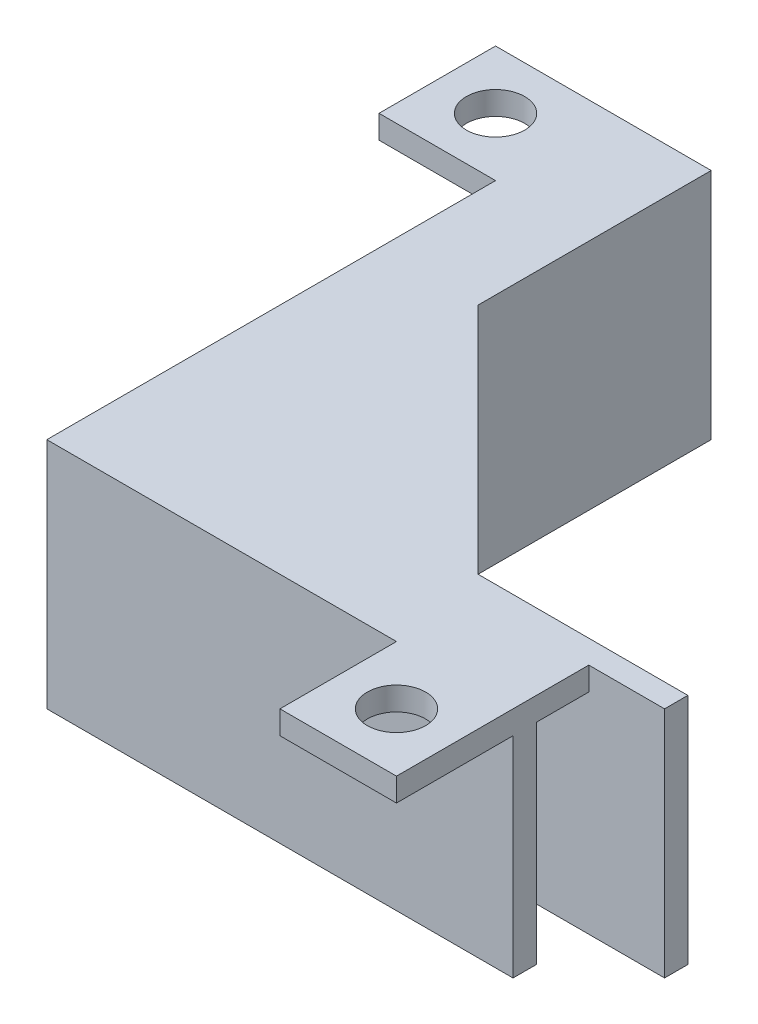
ISO-10303-21;
HEADER;
FILE_DESCRIPTION(('STEP AP214'),'2;1');
FILE_NAME('part.step','',(''),(''),'','','');
FILE_SCHEMA(('AUTOMOTIVE_DESIGN { 1 0 10303 214 1 1 1 1 }'));
ENDSEC;
DATA;
#1=APPLICATION_CONTEXT('core data for automotive mechanical design processes');
#2=APPLICATION_PROTOCOL_DEFINITION('international standard','automotive_design',2000,#1);
#3=PRODUCT_CONTEXT('',#1,'mechanical');
#4=PRODUCT('Part','Part','',(#3));
#5=PRODUCT_RELATED_PRODUCT_CATEGORY('part','',(#4));
#6=PRODUCT_DEFINITION_FORMATION('','',#4);
#7=PRODUCT_DEFINITION_CONTEXT('part definition',#1,'design');
#8=PRODUCT_DEFINITION('design','',#6,#7);
#9=PRODUCT_DEFINITION_SHAPE('','',#8);
#10=(LENGTH_UNIT() NAMED_UNIT(*) SI_UNIT(.MILLI.,.METRE.));
#11=(NAMED_UNIT(*) PLANE_ANGLE_UNIT() SI_UNIT($,.RADIAN.));
#12=(NAMED_UNIT(*) SI_UNIT($,.STERADIAN.) SOLID_ANGLE_UNIT());
#13=UNCERTAINTY_MEASURE_WITH_UNIT(LENGTH_MEASURE(1.E-05),#10,'distance_accuracy_value','');
#14=(GEOMETRIC_REPRESENTATION_CONTEXT(3) GLOBAL_UNCERTAINTY_ASSIGNED_CONTEXT((#13)) GLOBAL_UNIT_ASSIGNED_CONTEXT((#10,
#11,#12)) REPRESENTATION_CONTEXT('',''));
#15=CARTESIAN_POINT('',(0.,0.,0.));
#16=DIRECTION('',(0.,0.,1.));
#17=DIRECTION('',(1.,0.,0.));
#18=AXIS2_PLACEMENT_3D('',#15,#16,#17);
#19=CARTESIAN_POINT('',(0.,-20.,23.4620190166866));
#20=DIRECTION('',(0.,0.,1.));
#21=DIRECTION('',(1.,0.,0.));
#22=AXIS2_PLACEMENT_3D('',#19,#20,#21);
#23=PLANE('',#22);
#24=DIRECTION('',(0.,1.,0.));
#25=VECTOR('',#24,1.);
#26=CARTESIAN_POINT('',(19.496831563722,-20.,23.4620190166866));
#27=LINE('',#26,#25);
#28=CARTESIAN_POINT('',(19.496831563722,-20.,23.4620190166866));
#29=VERTEX_POINT('',#28);
#30=CARTESIAN_POINT('',(19.496831563722,-2.,23.4620190166866));
#31=VERTEX_POINT('',#30);
#32=EDGE_CURVE('E321',#29,#31,#27,.T.);
#33=ORIENTED_EDGE('',*,*,#32,.T.);
#34=DIRECTION('',(-1.,0.,0.));
#35=VECTOR('',#34,1.);
#36=CARTESIAN_POINT('',(19.496831563722,-2.,23.4620190166866));
#37=LINE('',#36,#35);
#38=CARTESIAN_POINT('',(9.49683156372203,-2.,23.4620190166866));
#39=VERTEX_POINT('',#38);
#40=EDGE_CURVE('E258',#31,#39,#37,.T.);
#41=ORIENTED_EDGE('',*,*,#40,.T.);
#42=DIRECTION('',(0.,1.,0.));
#43=VECTOR('',#42,1.);
#44=CARTESIAN_POINT('',(9.49683156372203,-2.,23.4620190166866));
#45=LINE('',#44,#43);
#46=CARTESIAN_POINT('',(9.49683156372203,0.,23.4620190166866));
#47=VERTEX_POINT('',#46);
#48=EDGE_CURVE('E268',#39,#47,#45,.T.);
#49=ORIENTED_EDGE('',*,*,#48,.T.);
#50=DIRECTION('',(1.,0.,0.));
#51=VECTOR('',#50,1.);
#52=CARTESIAN_POINT('',(0.,0.,23.4620190166866));
#53=LINE('',#52,#51);
#54=CARTESIAN_POINT('',(-20.503168436278,0.,23.4620190166866));
#55=VERTEX_POINT('',#54);
#56=EDGE_CURVE('E298',#55,#47,#53,.T.);
#57=ORIENTED_EDGE('',*,*,#56,.F.);
#58=DIRECTION('',(0.,1.,0.));
#59=VECTOR('',#58,1.);
#60=CARTESIAN_POINT('',(-20.503168436278,-20.,23.4620190166866));
#61=LINE('',#60,#59);
#62=CARTESIAN_POINT('',(-20.503168436278,-20.,23.4620190166866));
#63=VERTEX_POINT('',#62);
#64=EDGE_CURVE('E324',#63,#55,#61,.T.);
#65=ORIENTED_EDGE('',*,*,#64,.F.);
#66=DIRECTION('',(1.,0.,0.));
#67=VECTOR('',#66,1.);
#68=CARTESIAN_POINT('',(0.,-20.,23.4620190166866));
#69=LINE('',#68,#67);
#70=EDGE_CURVE('E303',#63,#29,#69,.T.);
#71=ORIENTED_EDGE('',*,*,#70,.T.);
#72=EDGE_LOOP('',(#33,#41,#49,#57,#65,#71));
#73=FACE_BOUND('',#72,.T.);
#74=ADVANCED_FACE('F71',(#73),#23,.T.);
#75=CARTESIAN_POINT('',(0.,-20.,16.9620190166866));
#76=DIRECTION('',(0.,0.,1.));
#77=DIRECTION('',(1.,0.,0.));
#78=AXIS2_PLACEMENT_3D('',#75,#76,#77);
#79=PLANE('',#78);
#80=DIRECTION('',(1.,0.,0.));
#81=VECTOR('',#80,1.);
#82=CARTESIAN_POINT('',(0.,0.,16.9620190166866));
#83=LINE('',#82,#81);
#84=CARTESIAN_POINT('',(19.496831563722,0.,16.9620190166866));
#85=VERTEX_POINT('',#84);
#86=CARTESIAN_POINT('',(25.996831563722,0.,16.9620190166866));
#87=VERTEX_POINT('',#86);
#88=EDGE_CURVE('E369',#85,#87,#83,.T.);
#89=ORIENTED_EDGE('',*,*,#88,.F.);
#90=DIRECTION('',(0.,1.,0.));
#91=VECTOR('',#90,1.);
#92=CARTESIAN_POINT('',(19.496831563722,-2.,16.9620190166866));
#93=LINE('',#92,#91);
#94=CARTESIAN_POINT('',(19.496831563722,-2.,16.9620190166866));
#95=VERTEX_POINT('',#94);
#96=EDGE_CURVE('E345',#95,#85,#93,.T.);
#97=ORIENTED_EDGE('',*,*,#96,.F.);
#98=DIRECTION('',(-1.,0.,0.));
#99=VECTOR('',#98,1.);
#100=CARTESIAN_POINT('',(0.,-2.,16.9620190166866));
#101=LINE('',#100,#99);
#102=CARTESIAN_POINT('',(-14.003168436278,-2.,16.9620190166866));
#103=VERTEX_POINT('',#102);
#104=EDGE_CURVE('E342',#95,#103,#101,.T.);
#105=ORIENTED_EDGE('',*,*,#104,.T.);
#106=DIRECTION('',(0.,1.,0.));
#107=VECTOR('',#106,1.);
#108=CARTESIAN_POINT('',(-14.003168436278,-20.,16.9620190166866));
#109=LINE('',#108,#107);
#110=CARTESIAN_POINT('',(-14.003168436278,-20.,16.9620190166866));
#111=VERTEX_POINT('',#110);
#112=EDGE_CURVE('E380',#111,#103,#109,.T.);
#113=ORIENTED_EDGE('',*,*,#112,.F.);
#114=DIRECTION('',(1.,0.,0.));
#115=VECTOR('',#114,1.);
#116=CARTESIAN_POINT('',(0.,-20.,16.9620190166866));
#117=LINE('',#116,#115);
#118=CARTESIAN_POINT('',(25.996831563722,-20.,16.9620190166866));
#119=VERTEX_POINT('',#118);
#120=EDGE_CURVE('E359',#111,#119,#117,.T.);
#121=ORIENTED_EDGE('',*,*,#120,.T.);
#122=DIRECTION('',(0.,1.,0.));
#123=VECTOR('',#122,1.);
#124=CARTESIAN_POINT('',(25.996831563722,-20.,16.9620190166866));
#125=LINE('',#124,#123);
#126=EDGE_CURVE('E377',#119,#87,#125,.T.);
#127=ORIENTED_EDGE('',*,*,#126,.T.);
#128=EDGE_LOOP('',(#89,#97,#105,#113,#121,#127));
#129=FACE_BOUND('',#128,.T.);
#130=ADVANCED_FACE('F422',(#129),#79,.T.);
#131=CARTESIAN_POINT('',(-14.003168436278,-20.,0.));
#132=DIRECTION('',(-1.,0.,0.));
#133=DIRECTION('',(0.,0.,1.));
#134=AXIS2_PLACEMENT_3D('',#131,#132,#133);
#135=PLANE('',#134);
#136=ORIENTED_EDGE('',*,*,#112,.T.);
#137=DIRECTION('',(0.,0.,1.));
#138=VECTOR('',#137,1.);
#139=CARTESIAN_POINT('',(-14.003168436278,-2.,0.));
#140=LINE('',#139,#138);
#141=CARTESIAN_POINT('',(-14.003168436278,-2.,-25.0379809833134));
#142=VERTEX_POINT('',#141);
#143=EDGE_CURVE('E330',#142,#103,#140,.T.);
#144=ORIENTED_EDGE('',*,*,#143,.F.);
#145=DIRECTION('',(0.,1.,0.));
#146=VECTOR('',#145,1.);
#147=CARTESIAN_POINT('',(-14.003168436278,-20.,-25.0379809833134));
#148=LINE('',#147,#146);
#149=CARTESIAN_POINT('',(-14.003168436278,-20.,-25.0379809833134));
#150=VERTEX_POINT('',#149);
#151=EDGE_CURVE('E382',#150,#142,#148,.T.);
#152=ORIENTED_EDGE('',*,*,#151,.F.);
#153=DIRECTION('',(0.,0.,1.));
#154=VECTOR('',#153,1.);
#155=CARTESIAN_POINT('',(-14.003168436278,-20.,0.));
#156=LINE('',#155,#154);
#157=EDGE_CURVE('E356',#150,#111,#156,.T.);
#158=ORIENTED_EDGE('',*,*,#157,.T.);
#159=EDGE_LOOP('',(#136,#144,#152,#158));
#160=FACE_BOUND('',#159,.T.);
#161=ADVANCED_FACE('F428',(#160),#135,.T.);
#162=CARTESIAN_POINT('',(-12.003168436278,-20.,0.));
#163=DIRECTION('',(-1.,0.,0.));
#164=DIRECTION('',(0.,0.,1.));
#165=AXIS2_PLACEMENT_3D('',#162,#163,#164);
#166=PLANE('',#165);
#167=DIRECTION('',(0.,0.,1.));
#168=VECTOR('',#167,1.);
#169=CARTESIAN_POINT('',(-12.003168436278,0.,0.));
#170=LINE('',#169,#168);
#171=CARTESIAN_POINT('',(-12.003168436278,0.,-25.0379809833134));
#172=VERTEX_POINT('',#171);
#173=CARTESIAN_POINT('',(-12.003168436278,0.,-5.03798098331345));
#174=VERTEX_POINT('',#173);
#175=EDGE_CURVE('E349',#172,#174,#170,.T.);
#176=ORIENTED_EDGE('',*,*,#175,.T.);
#177=DIRECTION('',(0.,1.,0.));
#178=VECTOR('',#177,1.);
#179=CARTESIAN_POINT('',(-12.003168436278,-2.,-5.03798098331345));
#180=LINE('',#179,#178);
#181=CARTESIAN_POINT('',(-12.003168436278,-2.,-5.03798098331345));
#182=VERTEX_POINT('',#181);
#183=EDGE_CURVE('E289',#182,#174,#180,.T.);
#184=ORIENTED_EDGE('',*,*,#183,.F.);
#185=DIRECTION('',(0.,0.,1.));
#186=VECTOR('',#185,1.);
#187=CARTESIAN_POINT('',(-12.003168436278,-2.,14.9620190166866));
#188=LINE('',#187,#186);
#189=CARTESIAN_POINT('',(-12.003168436278,-2.,14.9620190166866));
#190=VERTEX_POINT('',#189);
#191=EDGE_CURVE('E284',#182,#190,#188,.T.);
#192=ORIENTED_EDGE('',*,*,#191,.T.);
#193=DIRECTION('',(0.,1.,0.));
#194=VECTOR('',#193,1.);
#195=CARTESIAN_POINT('',(-12.003168436278,-20.,14.9620190166866));
#196=LINE('',#195,#194);
#197=CARTESIAN_POINT('',(-12.003168436278,-20.,14.9620190166866));
#198=VERTEX_POINT('',#197);
#199=EDGE_CURVE('E12',#198,#190,#196,.T.);
#200=ORIENTED_EDGE('',*,*,#199,.F.);
#201=DIRECTION('',(0.,0.,1.));
#202=VECTOR('',#201,1.);
#203=CARTESIAN_POINT('',(-12.003168436278,-20.,0.));
#204=LINE('',#203,#202);
#205=CARTESIAN_POINT('',(-12.003168436278,-20.,-25.0379809833134));
#206=VERTEX_POINT('',#205);
#207=EDGE_CURVE('E350',#206,#198,#204,.T.);
#208=ORIENTED_EDGE('',*,*,#207,.F.);
#209=DIRECTION('',(0.,1.,0.));
#210=VECTOR('',#209,1.);
#211=CARTESIAN_POINT('',(-12.003168436278,-20.,-25.0379809833134));
#212=LINE('',#211,#210);
#213=EDGE_CURVE('E75',#206,#172,#212,.T.);
#214=ORIENTED_EDGE('',*,*,#213,.T.);
#215=EDGE_LOOP('',(#176,#184,#192,#200,#208,#214));
#216=FACE_BOUND('',#215,.T.);
#217=ADVANCED_FACE('F73',(#216),#166,.F.);
#218=CARTESIAN_POINT('',(0.,-20.,14.9620190166866));
#219=DIRECTION('',(0.,0.,1.));
#220=DIRECTION('',(1.,0.,0.));
#221=AXIS2_PLACEMENT_3D('',#218,#219,#220);
#222=PLANE('',#221);
#223=DIRECTION('',(1.,0.,0.));
#224=VECTOR('',#223,1.);
#225=CARTESIAN_POINT('',(7.99683156372203,-2.,14.9620190166866));
#226=LINE('',#225,#224);
#227=CARTESIAN_POINT('',(7.99683156372203,-2.,14.9620190166866));
#228=VERTEX_POINT('',#227);
#229=EDGE_CURVE('E279',#190,#228,#226,.T.);
#230=ORIENTED_EDGE('',*,*,#229,.T.);
#231=DIRECTION('',(0.,1.,0.));
#232=VECTOR('',#231,1.);
#233=CARTESIAN_POINT('',(7.99683156372203,-2.,14.9620190166866));
#234=LINE('',#233,#232);
#235=CARTESIAN_POINT('',(7.99683156372203,0.,14.9620190166866));
#236=VERTEX_POINT('',#235);
#237=EDGE_CURVE('E286',#228,#236,#234,.T.);
#238=ORIENTED_EDGE('',*,*,#237,.T.);
#239=DIRECTION('',(1.,0.,0.));
#240=VECTOR('',#239,1.);
#241=CARTESIAN_POINT('',(0.,0.,14.9620190166866));
#242=LINE('',#241,#240);
#243=CARTESIAN_POINT('',(25.996831563722,0.,14.9620190166866));
#244=VERTEX_POINT('',#243);
#245=EDGE_CURVE('E354',#236,#244,#242,.T.);
#246=ORIENTED_EDGE('',*,*,#245,.T.);
#247=DIRECTION('',(0.,1.,0.));
#248=VECTOR('',#247,1.);
#249=CARTESIAN_POINT('',(25.996831563722,-20.,14.9620190166866));
#250=LINE('',#249,#248);
#251=CARTESIAN_POINT('',(25.996831563722,-20.,14.9620190166866));
#252=VERTEX_POINT('',#251);
#253=EDGE_CURVE('E80',#252,#244,#250,.T.);
#254=ORIENTED_EDGE('',*,*,#253,.F.);
#255=DIRECTION('',(1.,0.,0.));
#256=VECTOR('',#255,1.);
#257=CARTESIAN_POINT('',(0.,-20.,14.9620190166866));
#258=LINE('',#257,#256);
#259=EDGE_CURVE('E364',#198,#252,#258,.T.);
#260=ORIENTED_EDGE('',*,*,#259,.F.);
#261=ORIENTED_EDGE('',*,*,#199,.T.);
#262=EDGE_LOOP('',(#230,#238,#246,#254,#260,#261));
#263=FACE_BOUND('',#262,.T.);
#264=ADVANCED_FACE('F405',(#263),#222,.F.);
#265=CARTESIAN_POINT('',(25.996831563722,-20.,0.));
#266=DIRECTION('',(-1.,0.,0.));
#267=DIRECTION('',(0.,0.,1.));
#268=AXIS2_PLACEMENT_3D('',#265,#266,#267);
#269=PLANE('',#268);
#270=DIRECTION('',(0.,0.,1.));
#271=VECTOR('',#270,1.);
#272=CARTESIAN_POINT('',(25.996831563722,0.,0.));
#273=LINE('',#272,#271);
#274=EDGE_CURVE('E371',#244,#87,#273,.T.);
#275=ORIENTED_EDGE('',*,*,#274,.T.);
#276=ORIENTED_EDGE('',*,*,#126,.F.);
#277=DIRECTION('',(0.,0.,1.));
#278=VECTOR('',#277,1.);
#279=CARTESIAN_POINT('',(25.996831563722,-20.,0.));
#280=LINE('',#279,#278);
#281=EDGE_CURVE('E362',#252,#119,#280,.T.);
#282=ORIENTED_EDGE('',*,*,#281,.F.);
#283=ORIENTED_EDGE('',*,*,#253,.T.);
#284=EDGE_LOOP('',(#275,#276,#282,#283));
#285=FACE_BOUND('',#284,.T.);
#286=ADVANCED_FACE('F459',(#285),#269,.F.);
#287=CARTESIAN_POINT('',(0.,-20.,-25.0379809833134));
#288=DIRECTION('',(0.,0.,1.));
#289=DIRECTION('',(1.,0.,0.));
#290=AXIS2_PLACEMENT_3D('',#287,#288,#289);
#291=PLANE('',#290);
#292=DIRECTION('',(1.,0.,0.));
#293=VECTOR('',#292,1.);
#294=CARTESIAN_POINT('',(0.,0.,-25.0379809833134));
#295=LINE('',#294,#293);
#296=CARTESIAN_POINT('',(-30.503168436278,0.,-25.0379809833134));
#297=VERTEX_POINT('',#296);
#298=EDGE_CURVE('E367',#297,#172,#295,.T.);
#299=ORIENTED_EDGE('',*,*,#298,.T.);
#300=ORIENTED_EDGE('',*,*,#213,.F.);
#301=DIRECTION('',(1.,0.,0.));
#302=VECTOR('',#301,1.);
#303=CARTESIAN_POINT('',(0.,-20.,-25.0379809833134));
#304=LINE('',#303,#302);
#305=EDGE_CURVE('E353',#150,#206,#304,.T.);
#306=ORIENTED_EDGE('',*,*,#305,.F.);
#307=ORIENTED_EDGE('',*,*,#151,.T.);
#308=DIRECTION('',(1.,0.,0.));
#309=VECTOR('',#308,1.);
#310=CARTESIAN_POINT('',(0.,-2.,-25.0379809833134));
#311=LINE('',#310,#309);
#312=CARTESIAN_POINT('',(-18.503168436278,-2.,-25.0379809833134));
#313=VERTEX_POINT('',#312);
#314=EDGE_CURVE('E332',#313,#142,#311,.T.);
#315=ORIENTED_EDGE('',*,*,#314,.F.);
#316=DIRECTION('',(0.,1.,0.));
#317=VECTOR('',#316,1.);
#318=CARTESIAN_POINT('',(-18.503168436278,-20.,-25.0379809833134));
#319=LINE('',#318,#317);
#320=CARTESIAN_POINT('',(-18.503168436278,-20.,-25.0379809833134));
#321=VERTEX_POINT('',#320);
#322=EDGE_CURVE('E310',#321,#313,#319,.T.);
#323=ORIENTED_EDGE('',*,*,#322,.F.);
#324=DIRECTION('',(1.,0.,0.));
#325=VECTOR('',#324,1.);
#326=CARTESIAN_POINT('',(0.,-20.,-25.0379809833134));
#327=LINE('',#326,#325);
#328=CARTESIAN_POINT('',(-20.503168436278,-20.,-25.0379809833134));
#329=VERTEX_POINT('',#328);
#330=EDGE_CURVE('E297',#329,#321,#327,.T.);
#331=ORIENTED_EDGE('',*,*,#330,.F.);
#332=DIRECTION('',(0.,1.,0.));
#333=VECTOR('',#332,1.);
#334=CARTESIAN_POINT('',(-20.503168436278,-20.,-25.0379809833134));
#335=LINE('',#334,#333);
#336=CARTESIAN_POINT('',(-20.503168436278,-2.,-25.0379809833134));
#337=VERTEX_POINT('',#336);
#338=EDGE_CURVE('E234',#329,#337,#335,.T.);
#339=ORIENTED_EDGE('',*,*,#338,.T.);
#340=DIRECTION('',(-1.,0.,0.));
#341=VECTOR('',#340,1.);
#342=CARTESIAN_POINT('',(-20.503168436278,-2.,-25.0379809833134));
#343=LINE('',#342,#341);
#344=CARTESIAN_POINT('',(-30.503168436278,-2.,-25.0379809833134));
#345=VERTEX_POINT('',#344);
#346=EDGE_CURVE('E88',#337,#345,#343,.T.);
#347=ORIENTED_EDGE('',*,*,#346,.T.);
#348=DIRECTION('',(0.,1.,0.));
#349=VECTOR('',#348,1.);
#350=CARTESIAN_POINT('',(-30.503168436278,-2.,-25.0379809833134));
#351=LINE('',#350,#349);
#352=EDGE_CURVE('E218',#345,#297,#351,.T.);
#353=ORIENTED_EDGE('',*,*,#352,.T.);
#354=EDGE_LOOP('',(#299,#300,#306,#307,#315,#323,#331,#339,#347,#353));
#355=FACE_BOUND('',#354,.T.);
#356=ADVANCED_FACE('F232',(#355),#291,.F.);
#357=CARTESIAN_POINT('',(0.,-20.,0.));
#358=DIRECTION('',(0.,1.,0.));
#359=DIRECTION('',(0.,0.,1.));
#360=AXIS2_PLACEMENT_3D('',#357,#358,#359);
#361=PLANE('',#360);
#362=ORIENTED_EDGE('',*,*,#207,.T.);
#363=ORIENTED_EDGE('',*,*,#259,.T.);
#364=ORIENTED_EDGE('',*,*,#281,.T.);
#365=ORIENTED_EDGE('',*,*,#120,.F.);
#366=ORIENTED_EDGE('',*,*,#157,.F.);
#367=ORIENTED_EDGE('',*,*,#305,.T.);
#368=EDGE_LOOP('',(#362,#363,#364,#365,#366,#367));
#369=FACE_BOUND('',#368,.T.);
#370=ADVANCED_FACE('F451',(#369),#361,.F.);
#371=CARTESIAN_POINT('',(0.,0.,0.));
#372=DIRECTION('',(0.,1.,0.));
#373=DIRECTION('',(0.,0.,1.));
#374=AXIS2_PLACEMENT_3D('',#371,#372,#373);
#375=PLANE('',#374);
#376=ORIENTED_EDGE('',*,*,#245,.F.);
#377=DIRECTION('',(-0.707106781186548,0.,-0.707106781186548));
#378=VECTOR('',#377,1.);
#379=CARTESIAN_POINT('',(7.99683156372203,0.,14.9620190166866));
#380=LINE('',#379,#378);
#381=EDGE_CURVE('E275',#236,#174,#380,.T.);
#382=ORIENTED_EDGE('',*,*,#381,.T.);
#383=ORIENTED_EDGE('',*,*,#175,.F.);
#384=ORIENTED_EDGE('',*,*,#298,.F.);
#385=DIRECTION('',(0.,0.,1.));
#386=VECTOR('',#385,1.);
#387=CARTESIAN_POINT('',(-30.503168436278,0.,-25.0379809833134));
#388=LINE('',#387,#386);
#389=CARTESIAN_POINT('',(-30.503168436278,0.,-15.0379809833134));
#390=VERTEX_POINT('',#389);
#391=EDGE_CURVE('E223',#297,#390,#388,.T.);
#392=ORIENTED_EDGE('',*,*,#391,.T.);
#393=DIRECTION('',(1.,0.,0.));
#394=VECTOR('',#393,1.);
#395=CARTESIAN_POINT('',(-20.503168436278,0.,-15.0379809833134));
#396=LINE('',#395,#394);
#397=CARTESIAN_POINT('',(-20.503168436278,0.,-15.0379809833134));
#398=VERTEX_POINT('',#397);
#399=EDGE_CURVE('E237',#390,#398,#396,.T.);
#400=ORIENTED_EDGE('',*,*,#399,.T.);
#401=DIRECTION('',(0.,0.,1.));
#402=VECTOR('',#401,1.);
#403=CARTESIAN_POINT('',(-20.503168436278,0.,0.));
#404=LINE('',#403,#402);
#405=EDGE_CURVE('E292',#398,#55,#404,.T.);
#406=ORIENTED_EDGE('',*,*,#405,.T.);
#407=ORIENTED_EDGE('',*,*,#56,.T.);
#408=DIRECTION('',(0.,0.,1.));
#409=VECTOR('',#408,1.);
#410=CARTESIAN_POINT('',(9.49683156372203,0.,23.4620190166866));
#411=LINE('',#410,#409);
#412=CARTESIAN_POINT('',(9.49683156372203,0.,33.4620190166866));
#413=VERTEX_POINT('',#412);
#414=EDGE_CURVE('E96',#47,#413,#411,.T.);
#415=ORIENTED_EDGE('',*,*,#414,.T.);
#416=DIRECTION('',(1.,0.,0.));
#417=VECTOR('',#416,1.);
#418=CARTESIAN_POINT('',(19.496831563722,0.,33.4620190166866));
#419=LINE('',#418,#417);
#420=CARTESIAN_POINT('',(19.496831563722,0.,33.4620190166866));
#421=VERTEX_POINT('',#420);
#422=EDGE_CURVE('E259',#413,#421,#419,.T.);
#423=ORIENTED_EDGE('',*,*,#422,.T.);
#424=DIRECTION('',(0.,0.,1.));
#425=VECTOR('',#424,1.);
#426=CARTESIAN_POINT('',(19.496831563722,0.,0.));
#427=LINE('',#426,#425);
#428=EDGE_CURVE('E317',#85,#421,#427,.T.);
#429=ORIENTED_EDGE('',*,*,#428,.F.);
#430=ORIENTED_EDGE('',*,*,#88,.T.);
#431=ORIENTED_EDGE('',*,*,#274,.F.);
#432=EDGE_LOOP('',(#376,#382,#383,#384,#392,#400,#406,#407,#415,#423,#429,#430,#431));
#433=FACE_BOUND('',#432,.T.);
#434=CARTESIAN_POINT('',(14.496831563722,0.,28.4620190166866));
#435=DIRECTION('',(0.,1.,0.));
#436=DIRECTION('',(0.,0.,1.));
#437=AXIS2_PLACEMENT_3D('',#434,#435,#436);
#438=CIRCLE('',#437,2.5);
#439=CARTESIAN_POINT('',(14.496831563722,0.,30.9620190166866));
#440=VERTEX_POINT('',#439);
#441=EDGE_CURVE('E248',#440,#440,#438,.T.);
#442=ORIENTED_EDGE('',*,*,#441,.F.);
#443=EDGE_LOOP('',(#442));
#444=FACE_BOUND('',#443,.T.);
#445=CARTESIAN_POINT('',(-25.503168436278,0.,-20.0379809833134));
#446=DIRECTION('',(0.,1.,0.));
#447=DIRECTION('',(0.,0.,1.));
#448=AXIS2_PLACEMENT_3D('',#445,#446,#447);
#449=CIRCLE('',#448,2.5);
#450=CARTESIAN_POINT('',(-25.503168436278,0.,-17.5379809833134));
#451=VERTEX_POINT('',#450);
#452=EDGE_CURVE('E596',#451,#451,#449,.T.);
#453=ORIENTED_EDGE('',*,*,#452,.F.);
#454=EDGE_LOOP('',(#453));
#455=FACE_BOUND('',#454,.T.);
#456=ADVANCED_FACE('F393',(#433,#444,#455),#375,.T.);
#457=CARTESIAN_POINT('',(19.496831563722,-2.,0.));
#458=DIRECTION('',(-1.,0.,0.));
#459=DIRECTION('',(0.,0.,1.));
#460=AXIS2_PLACEMENT_3D('',#457,#458,#459);
#461=PLANE('',#460);
#462=ORIENTED_EDGE('',*,*,#428,.T.);
#463=DIRECTION('',(0.,1.,0.));
#464=VECTOR('',#463,1.);
#465=CARTESIAN_POINT('',(19.496831563722,-2.,33.4620190166866));
#466=LINE('',#465,#464);
#467=CARTESIAN_POINT('',(19.496831563722,-2.,33.4620190166866));
#468=VERTEX_POINT('',#467);
#469=EDGE_CURVE('E272',#468,#421,#466,.T.);
#470=ORIENTED_EDGE('',*,*,#469,.F.);
#471=DIRECTION('',(0.,0.,-1.));
#472=VECTOR('',#471,1.);
#473=CARTESIAN_POINT('',(19.496831563722,-2.,23.4620190166866));
#474=LINE('',#473,#472);
#475=EDGE_CURVE('E255',#468,#31,#474,.T.);
#476=ORIENTED_EDGE('',*,*,#475,.T.);
#477=ORIENTED_EDGE('',*,*,#32,.F.);
#478=DIRECTION('',(0.,0.,1.));
#479=VECTOR('',#478,1.);
#480=CARTESIAN_POINT('',(19.496831563722,-20.,0.));
#481=LINE('',#480,#479);
#482=CARTESIAN_POINT('',(19.496831563722,-20.,21.4620190166866));
#483=VERTEX_POINT('',#482);
#484=EDGE_CURVE('E306',#483,#29,#481,.T.);
#485=ORIENTED_EDGE('',*,*,#484,.F.);
#486=DIRECTION('',(0.,1.,0.));
#487=VECTOR('',#486,1.);
#488=CARTESIAN_POINT('',(19.496831563722,-20.,21.4620190166866));
#489=LINE('',#488,#487);
#490=CARTESIAN_POINT('',(19.496831563722,-2.,21.4620190166866));
#491=VERTEX_POINT('',#490);
#492=EDGE_CURVE('E318',#483,#491,#489,.T.);
#493=ORIENTED_EDGE('',*,*,#492,.T.);
#494=DIRECTION('',(0.,0.,1.));
#495=VECTOR('',#494,1.);
#496=CARTESIAN_POINT('',(19.496831563722,-2.,0.));
#497=LINE('',#496,#495);
#498=EDGE_CURVE('E340',#95,#491,#497,.T.);
#499=ORIENTED_EDGE('',*,*,#498,.F.);
#500=ORIENTED_EDGE('',*,*,#96,.T.);
#501=EDGE_LOOP('',(#462,#470,#476,#477,#485,#493,#499,#500));
#502=FACE_BOUND('',#501,.T.);
#503=ADVANCED_FACE('F446',(#502),#461,.F.);
#504=CARTESIAN_POINT('',(0.,-2.,0.));
#505=DIRECTION('',(0.,1.,0.));
#506=DIRECTION('',(0.,0.,1.));
#507=AXIS2_PLACEMENT_3D('',#504,#505,#506);
#508=PLANE('',#507);
#509=ORIENTED_EDGE('',*,*,#143,.T.);
#510=ORIENTED_EDGE('',*,*,#104,.F.);
#511=ORIENTED_EDGE('',*,*,#498,.T.);
#512=DIRECTION('',(1.,0.,0.));
#513=VECTOR('',#512,1.);
#514=CARTESIAN_POINT('',(0.,-2.,21.4620190166866));
#515=LINE('',#514,#513);
#516=CARTESIAN_POINT('',(-18.503168436278,-2.,21.4620190166866));
#517=VERTEX_POINT('',#516);
#518=EDGE_CURVE('E337',#517,#491,#515,.T.);
#519=ORIENTED_EDGE('',*,*,#518,.F.);
#520=DIRECTION('',(0.,0.,1.));
#521=VECTOR('',#520,1.);
#522=CARTESIAN_POINT('',(-18.503168436278,-2.,0.));
#523=LINE('',#522,#521);
#524=EDGE_CURVE('E334',#313,#517,#523,.T.);
#525=ORIENTED_EDGE('',*,*,#524,.F.);
#526=ORIENTED_EDGE('',*,*,#314,.T.);
#527=EDGE_LOOP('',(#509,#510,#511,#519,#525,#526));
#528=FACE_BOUND('',#527,.T.);
#529=ADVANCED_FACE('F442',(#528),#508,.F.);
#530=CARTESIAN_POINT('',(-18.503168436278,-20.,0.));
#531=DIRECTION('',(-1.,0.,0.));
#532=DIRECTION('',(0.,0.,1.));
#533=AXIS2_PLACEMENT_3D('',#530,#531,#532);
#534=PLANE('',#533);
#535=ORIENTED_EDGE('',*,*,#322,.T.);
#536=ORIENTED_EDGE('',*,*,#524,.T.);
#537=DIRECTION('',(0.,1.,0.));
#538=VECTOR('',#537,1.);
#539=CARTESIAN_POINT('',(-18.503168436278,-20.,21.4620190166866));
#540=LINE('',#539,#538);
#541=CARTESIAN_POINT('',(-18.503168436278,-20.,21.4620190166866));
#542=VERTEX_POINT('',#541);
#543=EDGE_CURVE('E314',#542,#517,#540,.T.);
#544=ORIENTED_EDGE('',*,*,#543,.F.);
#545=DIRECTION('',(0.,0.,1.));
#546=VECTOR('',#545,1.);
#547=CARTESIAN_POINT('',(-18.503168436278,-20.,0.));
#548=LINE('',#547,#546);
#549=EDGE_CURVE('E294',#321,#542,#548,.T.);
#550=ORIENTED_EDGE('',*,*,#549,.F.);
#551=EDGE_LOOP('',(#535,#536,#544,#550));
#552=FACE_BOUND('',#551,.T.);
#553=ADVANCED_FACE('F439',(#552),#534,.F.);
#554=CARTESIAN_POINT('',(0.,-20.,21.4620190166866));
#555=DIRECTION('',(0.,0.,1.));
#556=DIRECTION('',(1.,0.,0.));
#557=AXIS2_PLACEMENT_3D('',#554,#555,#556);
#558=PLANE('',#557);
#559=ORIENTED_EDGE('',*,*,#543,.T.);
#560=ORIENTED_EDGE('',*,*,#518,.T.);
#561=ORIENTED_EDGE('',*,*,#492,.F.);
#562=DIRECTION('',(1.,0.,0.));
#563=VECTOR('',#562,1.);
#564=CARTESIAN_POINT('',(0.,-20.,21.4620190166866));
#565=LINE('',#564,#563);
#566=EDGE_CURVE('E308',#542,#483,#565,.T.);
#567=ORIENTED_EDGE('',*,*,#566,.F.);
#568=EDGE_LOOP('',(#559,#560,#561,#567));
#569=FACE_BOUND('',#568,.T.);
#570=ADVANCED_FACE('F433',(#569),#558,.F.);
#571=CARTESIAN_POINT('',(-20.503168436278,-20.,0.));
#572=DIRECTION('',(-1.,0.,0.));
#573=DIRECTION('',(0.,0.,1.));
#574=AXIS2_PLACEMENT_3D('',#571,#572,#573);
#575=PLANE('',#574);
#576=DIRECTION('',(0.,1.,0.));
#577=VECTOR('',#576,1.);
#578=CARTESIAN_POINT('',(-20.503168436278,-2.,-15.0379809833134));
#579=LINE('',#578,#577);
#580=CARTESIAN_POINT('',(-20.503168436278,-2.,-15.0379809833134));
#581=VERTEX_POINT('',#580);
#582=EDGE_CURVE('E246',#581,#398,#579,.T.);
#583=ORIENTED_EDGE('',*,*,#582,.F.);
#584=DIRECTION('',(0.,0.,-1.));
#585=VECTOR('',#584,1.);
#586=CARTESIAN_POINT('',(-20.503168436278,-2.,-25.0379809833134));
#587=LINE('',#586,#585);
#588=EDGE_CURVE('E235',#581,#337,#587,.T.);
#589=ORIENTED_EDGE('',*,*,#588,.T.);
#590=ORIENTED_EDGE('',*,*,#338,.F.);
#591=DIRECTION('',(0.,0.,1.));
#592=VECTOR('',#591,1.);
#593=CARTESIAN_POINT('',(-20.503168436278,-20.,0.));
#594=LINE('',#593,#592);
#595=EDGE_CURVE('E300',#329,#63,#594,.T.);
#596=ORIENTED_EDGE('',*,*,#595,.T.);
#597=ORIENTED_EDGE('',*,*,#64,.T.);
#598=ORIENTED_EDGE('',*,*,#405,.F.);
#599=EDGE_LOOP('',(#583,#589,#590,#596,#597,#598));
#600=FACE_BOUND('',#599,.T.);
#601=ADVANCED_FACE('F435',(#600),#575,.T.);
#602=CARTESIAN_POINT('',(0.,-20.,0.));
#603=DIRECTION('',(0.,1.,0.));
#604=DIRECTION('',(0.,0.,1.));
#605=AXIS2_PLACEMENT_3D('',#602,#603,#604);
#606=PLANE('',#605);
#607=ORIENTED_EDGE('',*,*,#549,.T.);
#608=ORIENTED_EDGE('',*,*,#566,.T.);
#609=ORIENTED_EDGE('',*,*,#484,.T.);
#610=ORIENTED_EDGE('',*,*,#70,.F.);
#611=ORIENTED_EDGE('',*,*,#595,.F.);
#612=ORIENTED_EDGE('',*,*,#330,.T.);
#613=EDGE_LOOP('',(#607,#608,#609,#610,#611,#612));
#614=FACE_BOUND('',#613,.T.);
#615=ADVANCED_FACE('F418',(#614),#606,.F.);
#616=CARTESIAN_POINT('',(7.99683156372203,-2.,14.9620190166866));
#617=DIRECTION('',(0.707106781186547,0.,-0.707106781186547));
#618=DIRECTION('',(-0.707106781186548,0.,-0.707106781186548));
#619=AXIS2_PLACEMENT_3D('',#616,#617,#618);
#620=PLANE('',#619);
#621=ORIENTED_EDGE('',*,*,#381,.F.);
#622=ORIENTED_EDGE('',*,*,#237,.F.);
#623=DIRECTION('',(-0.707106781186548,0.,-0.707106781186548));
#624=VECTOR('',#623,1.);
#625=CARTESIAN_POINT('',(7.99683156372203,-2.,14.9620190166866));
#626=LINE('',#625,#624);
#627=EDGE_CURVE('E281',#228,#182,#626,.T.);
#628=ORIENTED_EDGE('',*,*,#627,.T.);
#629=ORIENTED_EDGE('',*,*,#183,.T.);
#630=EDGE_LOOP('',(#621,#622,#628,#629));
#631=FACE_BOUND('',#630,.T.);
#632=ADVANCED_FACE('F399',(#631),#620,.T.);
#633=CARTESIAN_POINT('',(0.,-2.,0.));
#634=DIRECTION('',(0.,-1.,0.));
#635=DIRECTION('',(0.,0.,-1.));
#636=AXIS2_PLACEMENT_3D('',#633,#634,#635);
#637=PLANE('',#636);
#638=ORIENTED_EDGE('',*,*,#229,.F.);
#639=ORIENTED_EDGE('',*,*,#191,.F.);
#640=ORIENTED_EDGE('',*,*,#627,.F.);
#641=EDGE_LOOP('',(#638,#639,#640));
#642=FACE_BOUND('',#641,.T.);
#643=ADVANCED_FACE('F407',(#642),#637,.T.);
#644=CARTESIAN_POINT('',(19.496831563722,-2.,33.4620190166866));
#645=DIRECTION('',(0.,0.,1.));
#646=DIRECTION('',(1.,0.,0.));
#647=AXIS2_PLACEMENT_3D('',#644,#645,#646);
#648=PLANE('',#647);
#649=ORIENTED_EDGE('',*,*,#422,.F.);
#650=DIRECTION('',(0.,1.,0.));
#651=VECTOR('',#650,1.);
#652=CARTESIAN_POINT('',(9.49683156372203,-2.,33.4620190166866));
#653=LINE('',#652,#651);
#654=CARTESIAN_POINT('',(9.49683156372203,-2.,33.4620190166866));
#655=VERTEX_POINT('',#654);
#656=EDGE_CURVE('E276',#655,#413,#653,.T.);
#657=ORIENTED_EDGE('',*,*,#656,.F.);
#658=DIRECTION('',(1.,0.,0.));
#659=VECTOR('',#658,1.);
#660=CARTESIAN_POINT('',(19.496831563722,-2.,33.4620190166866));
#661=LINE('',#660,#659);
#662=EDGE_CURVE('E265',#655,#468,#661,.T.);
#663=ORIENTED_EDGE('',*,*,#662,.T.);
#664=ORIENTED_EDGE('',*,*,#469,.T.);
#665=EDGE_LOOP('',(#649,#657,#663,#664));
#666=FACE_BOUND('',#665,.T.);
#667=ADVANCED_FACE('F409',(#666),#648,.T.);
#668=CARTESIAN_POINT('',(9.49683156372203,-2.,23.4620190166866));
#669=DIRECTION('',(-1.,0.,0.));
#670=DIRECTION('',(0.,0.,1.));
#671=AXIS2_PLACEMENT_3D('',#668,#669,#670);
#672=PLANE('',#671);
#673=ORIENTED_EDGE('',*,*,#414,.F.);
#674=ORIENTED_EDGE('',*,*,#48,.F.);
#675=DIRECTION('',(0.,0.,1.));
#676=VECTOR('',#675,1.);
#677=CARTESIAN_POINT('',(9.49683156372203,-2.,23.4620190166866));
#678=LINE('',#677,#676);
#679=EDGE_CURVE('E262',#39,#655,#678,.T.);
#680=ORIENTED_EDGE('',*,*,#679,.T.);
#681=ORIENTED_EDGE('',*,*,#656,.T.);
#682=EDGE_LOOP('',(#673,#674,#680,#681));
#683=FACE_BOUND('',#682,.T.);
#684=ADVANCED_FACE('F415',(#683),#672,.T.);
#685=CARTESIAN_POINT('',(0.,-2.,0.));
#686=DIRECTION('',(0.,-1.,0.));
#687=DIRECTION('',(0.,0.,-1.));
#688=AXIS2_PLACEMENT_3D('',#685,#686,#687);
#689=PLANE('',#688);
#690=CARTESIAN_POINT('',(14.496831563722,-2.,28.4620190166866));
#691=DIRECTION('',(0.,1.,0.));
#692=DIRECTION('',(0.,0.,1.));
#693=AXIS2_PLACEMENT_3D('',#690,#691,#692);
#694=CIRCLE('',#693,2.5);
#695=CARTESIAN_POINT('',(14.496831563722,-2.,30.9620190166866));
#696=VERTEX_POINT('',#695);
#697=EDGE_CURVE('E250',#696,#696,#694,.T.);
#698=ORIENTED_EDGE('',*,*,#697,.T.);
#699=EDGE_LOOP('',(#698));
#700=FACE_BOUND('',#699,.T.);
#701=ORIENTED_EDGE('',*,*,#475,.F.);
#702=ORIENTED_EDGE('',*,*,#662,.F.);
#703=ORIENTED_EDGE('',*,*,#679,.F.);
#704=ORIENTED_EDGE('',*,*,#40,.F.);
#705=EDGE_LOOP('',(#701,#702,#703,#704));
#706=FACE_BOUND('',#705,.T.);
#707=ADVANCED_FACE('F532',(#700,#706),#689,.T.);
#708=CARTESIAN_POINT('',(14.496831563722,-2.,28.4620190166866));
#709=DIRECTION('',(0.,1.,0.));
#710=DIRECTION('',(0.,0.,1.));
#711=AXIS2_PLACEMENT_3D('',#708,#709,#710);
#712=CYLINDRICAL_SURFACE('',#711,2.5);
#713=ORIENTED_EDGE('',*,*,#697,.F.);
#714=EDGE_LOOP('',(#713));
#715=FACE_BOUND('',#714,.T.);
#716=ORIENTED_EDGE('',*,*,#441,.T.);
#717=EDGE_LOOP('',(#716));
#718=FACE_BOUND('',#717,.T.);
#719=ADVANCED_FACE('F540',(#715,#718),#712,.F.);
#720=CARTESIAN_POINT('',(-20.503168436278,-2.,-15.0379809833134));
#721=DIRECTION('',(0.,0.,1.));
#722=DIRECTION('',(1.,0.,0.));
#723=AXIS2_PLACEMENT_3D('',#720,#721,#722);
#724=PLANE('',#723);
#725=ORIENTED_EDGE('',*,*,#399,.F.);
#726=DIRECTION('',(0.,1.,0.));
#727=VECTOR('',#726,1.);
#728=CARTESIAN_POINT('',(-30.503168436278,-2.,-15.0379809833134));
#729=LINE('',#728,#727);
#730=CARTESIAN_POINT('',(-30.503168436278,-2.,-15.0379809833134));
#731=VERTEX_POINT('',#730);
#732=EDGE_CURVE('E225',#731,#390,#729,.T.);
#733=ORIENTED_EDGE('',*,*,#732,.F.);
#734=DIRECTION('',(1.,0.,0.));
#735=VECTOR('',#734,1.);
#736=CARTESIAN_POINT('',(-20.503168436278,-2.,-15.0379809833134));
#737=LINE('',#736,#735);
#738=EDGE_CURVE('E226',#731,#581,#737,.T.);
#739=ORIENTED_EDGE('',*,*,#738,.T.);
#740=ORIENTED_EDGE('',*,*,#582,.T.);
#741=EDGE_LOOP('',(#725,#733,#739,#740));
#742=FACE_BOUND('',#741,.T.);
#743=ADVANCED_FACE('F550',(#742),#724,.T.);
#744=CARTESIAN_POINT('',(-30.503168436278,-2.,-25.0379809833134));
#745=DIRECTION('',(-1.,0.,0.));
#746=DIRECTION('',(0.,0.,1.));
#747=AXIS2_PLACEMENT_3D('',#744,#745,#746);
#748=PLANE('',#747);
#749=ORIENTED_EDGE('',*,*,#391,.F.);
#750=ORIENTED_EDGE('',*,*,#352,.F.);
#751=DIRECTION('',(0.,0.,1.));
#752=VECTOR('',#751,1.);
#753=CARTESIAN_POINT('',(-30.503168436278,-2.,-25.0379809833134));
#754=LINE('',#753,#752);
#755=EDGE_CURVE('E220',#345,#731,#754,.T.);
#756=ORIENTED_EDGE('',*,*,#755,.T.);
#757=ORIENTED_EDGE('',*,*,#732,.T.);
#758=EDGE_LOOP('',(#749,#750,#756,#757));
#759=FACE_BOUND('',#758,.T.);
#760=ADVANCED_FACE('F219',(#759),#748,.T.);
#761=CARTESIAN_POINT('',(0.,-2.,0.));
#762=DIRECTION('',(0.,-1.,0.));
#763=DIRECTION('',(0.,0.,-1.));
#764=AXIS2_PLACEMENT_3D('',#761,#762,#763);
#765=PLANE('',#764);
#766=CARTESIAN_POINT('',(-25.503168436278,-2.,-20.0379809833134));
#767=DIRECTION('',(0.,1.,0.));
#768=DIRECTION('',(0.,0.,1.));
#769=AXIS2_PLACEMENT_3D('',#766,#767,#768);
#770=CIRCLE('',#769,2.5);
#771=CARTESIAN_POINT('',(-25.503168436278,-2.,-17.5379809833134));
#772=VERTEX_POINT('',#771);
#773=EDGE_CURVE('E243',#772,#772,#770,.T.);
#774=ORIENTED_EDGE('',*,*,#773,.T.);
#775=EDGE_LOOP('',(#774));
#776=FACE_BOUND('',#775,.T.);
#777=ORIENTED_EDGE('',*,*,#588,.F.);
#778=ORIENTED_EDGE('',*,*,#738,.F.);
#779=ORIENTED_EDGE('',*,*,#755,.F.);
#780=ORIENTED_EDGE('',*,*,#346,.F.);
#781=EDGE_LOOP('',(#777,#778,#779,#780));
#782=FACE_BOUND('',#781,.T.);
#783=ADVANCED_FACE('F228',(#776,#782),#765,.T.);
#784=CARTESIAN_POINT('',(-25.503168436278,-2.,-20.0379809833134));
#785=DIRECTION('',(0.,1.,0.));
#786=DIRECTION('',(0.,0.,1.));
#787=AXIS2_PLACEMENT_3D('',#784,#785,#786);
#788=CYLINDRICAL_SURFACE('',#787,2.5);
#789=ORIENTED_EDGE('',*,*,#773,.F.);
#790=EDGE_LOOP('',(#789));
#791=FACE_BOUND('',#790,.T.);
#792=ORIENTED_EDGE('',*,*,#452,.T.);
#793=EDGE_LOOP('',(#792));
#794=FACE_BOUND('',#793,.T.);
#795=ADVANCED_FACE('F577',(#791,#794),#788,.F.);
#796=CLOSED_SHELL('',(#74,#130,#161,#217,#264,#286,#356,#370,#456,#503,#529,#553,#570,#601,#615,
#632,#643,#667,#684,#707,#719,#743,#760,#783,#795));
#797=MANIFOLD_SOLID_BREP('B2',#796);
#798=ADVANCED_BREP_SHAPE_REPRESENTATION('',(#18,#797),#14);
#799=SHAPE_DEFINITION_REPRESENTATION(#9,#798);
ENDSEC;
END-ISO-10303-21;
